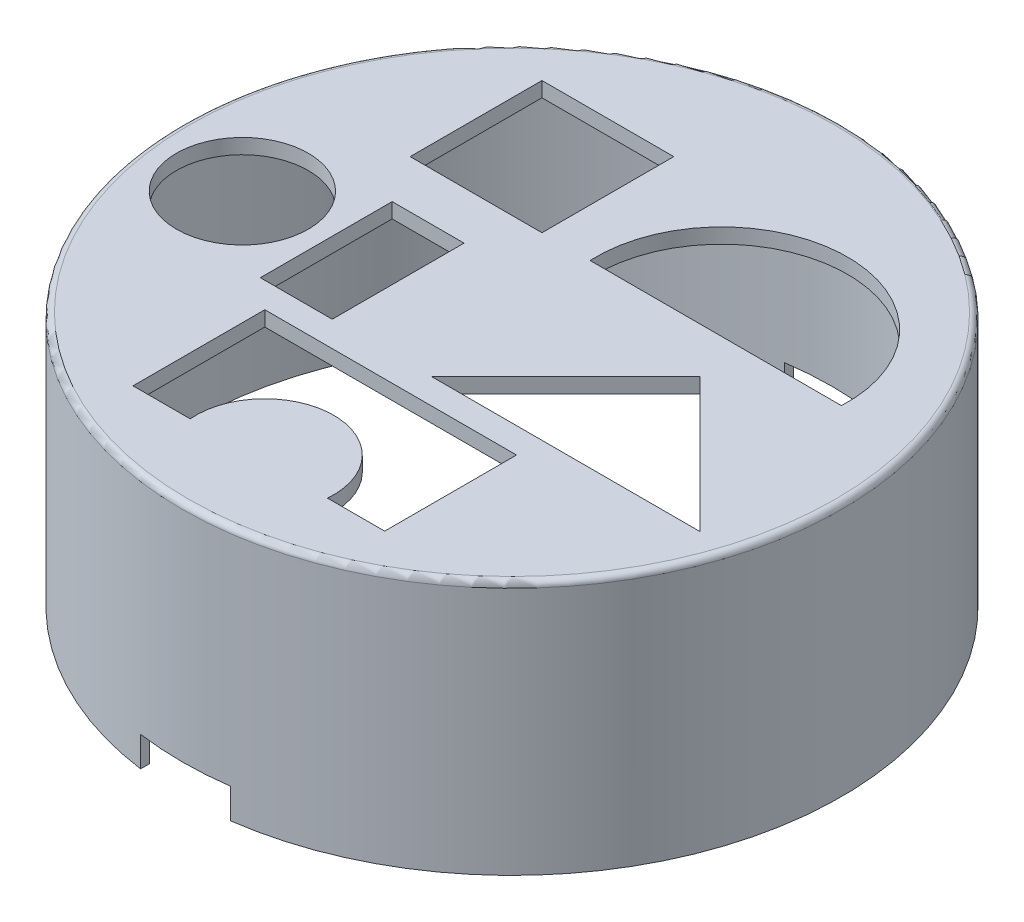
ISO-10303-21;
HEADER;
FILE_DESCRIPTION(('STEP AP214'),'2;1');
FILE_NAME('part.step','',(''),(''),'','','');
FILE_SCHEMA(('AUTOMOTIVE_DESIGN { 1 0 10303 214 1 1 1 1 }'));
ENDSEC;
DATA;
#1=APPLICATION_CONTEXT('core data for automotive mechanical design processes');
#2=APPLICATION_PROTOCOL_DEFINITION('international standard','automotive_design',2000,#1);
#3=PRODUCT_CONTEXT('',#1,'mechanical');
#4=PRODUCT('Part','Part','',(#3));
#5=PRODUCT_RELATED_PRODUCT_CATEGORY('part','',(#4));
#6=PRODUCT_DEFINITION_FORMATION('','',#4);
#7=PRODUCT_DEFINITION_CONTEXT('part definition',#1,'design');
#8=PRODUCT_DEFINITION('design','',#6,#7);
#9=PRODUCT_DEFINITION_SHAPE('','',#8);
#10=(LENGTH_UNIT() NAMED_UNIT(*) SI_UNIT(.MILLI.,.METRE.));
#11=(NAMED_UNIT(*) PLANE_ANGLE_UNIT() SI_UNIT($,.RADIAN.));
#12=(NAMED_UNIT(*) SI_UNIT($,.STERADIAN.) SOLID_ANGLE_UNIT());
#13=UNCERTAINTY_MEASURE_WITH_UNIT(LENGTH_MEASURE(1.E-05),#10,'distance_accuracy_value','');
#14=(GEOMETRIC_REPRESENTATION_CONTEXT(3) GLOBAL_UNCERTAINTY_ASSIGNED_CONTEXT((#13)) GLOBAL_UNIT_ASSIGNED_CONTEXT((#10,
#11,#12)) REPRESENTATION_CONTEXT('',''));
#15=CARTESIAN_POINT('',(0.,0.,0.));
#16=DIRECTION('',(0.,0.,1.));
#17=DIRECTION('',(1.,0.,0.));
#18=AXIS2_PLACEMENT_3D('',#15,#16,#17);
#19=CARTESIAN_POINT('',(0.,-40.,0.));
#20=DIRECTION('',(0.,-1.,0.));
#21=DIRECTION('',(0.,0.,-1.));
#22=AXIS2_PLACEMENT_3D('',#19,#20,#21);
#23=PLANE('',#22);
#24=DIRECTION('',(0.,0.,1.));
#25=VECTOR('',#24,1.);
#26=CARTESIAN_POINT('',(7.5,-40.,-55.));
#27=LINE('',#26,#25);
#28=CARTESIAN_POINT('',(7.5,-40.,-54.4862367942584));
#29=VERTEX_POINT('',#28);
#30=CARTESIAN_POINT('',(7.5,-40.,-52.9716905525961));
#31=VERTEX_POINT('',#30);
#32=EDGE_CURVE('E249',#29,#31,#27,.T.);
#33=ORIENTED_EDGE('',*,*,#32,.F.);
#34=CARTESIAN_POINT('',(0.,-40.,0.));
#35=DIRECTION('',(0.,-1.,0.));
#36=DIRECTION('',(0.,0.,-1.));
#37=AXIS2_PLACEMENT_3D('',#34,#35,#36);
#38=CIRCLE('',#37,55.);
#39=CARTESIAN_POINT('',(7.5,-40.,54.4862367942584));
#40=VERTEX_POINT('',#39);
#41=EDGE_CURVE('E420',#29,#40,#38,.T.);
#42=ORIENTED_EDGE('',*,*,#41,.T.);
#43=CARTESIAN_POINT('',(7.5,-40.,52.9716905525961));
#44=VERTEX_POINT('',#43);
#45=EDGE_CURVE('E443',#44,#40,#27,.T.);
#46=ORIENTED_EDGE('',*,*,#45,.F.);
#47=CARTESIAN_POINT('',(0.,-40.,0.));
#48=DIRECTION('',(0.,-1.,0.));
#49=DIRECTION('',(0.,0.,-1.));
#50=AXIS2_PLACEMENT_3D('',#47,#48,#49);
#51=CIRCLE('',#50,53.5);
#52=EDGE_CURVE('E415',#31,#44,#51,.T.);
#53=ORIENTED_EDGE('',*,*,#52,.F.);
#54=EDGE_LOOP('',(#33,#42,#46,#53));
#55=FACE_BOUND('',#54,.T.);
#56=ADVANCED_FACE('F39',(#55),#23,.T.);
#57=CARTESIAN_POINT('',(0.,0.,0.));
#58=DIRECTION('',(0.,1.,0.));
#59=DIRECTION('',(0.,0.,1.));
#60=AXIS2_PLACEMENT_3D('',#57,#58,#59);
#61=PLANE('',#60);
#62=CARTESIAN_POINT('',(0.,0.,0.));
#63=DIRECTION('',(0.,1.,0.));
#64=DIRECTION('',(0.,0.,1.));
#65=AXIS2_PLACEMENT_3D('',#62,#63,#64);
#66=CIRCLE('',#65,52.5);
#67=CARTESIAN_POINT('',(0.,0.,52.5));
#68=VERTEX_POINT('',#67);
#69=EDGE_CURVE('E427',#68,#68,#66,.F.);
#70=ORIENTED_EDGE('',*,*,#69,.T.);
#71=EDGE_LOOP('',(#70));
#72=FACE_BOUND('',#71,.T.);
#73=CARTESIAN_POINT('',(-40.,0.,5.00000000000001));
#74=DIRECTION('',(0.,1.,0.));
#75=DIRECTION('',(0.,0.,1.));
#76=AXIS2_PLACEMENT_3D('',#73,#74,#75);
#77=CIRCLE('',#76,11.);
#78=CARTESIAN_POINT('',(-40.,0.,16.));
#79=VERTEX_POINT('',#78);
#80=EDGE_CURVE('E355',#79,#79,#77,.T.);
#81=ORIENTED_EDGE('',*,*,#80,.T.);
#82=EDGE_LOOP('',(#81));
#83=FACE_BOUND('',#82,.T.);
#84=DIRECTION('',(0.,0.,1.));
#85=VECTOR('',#84,1.);
#86=CARTESIAN_POINT('',(-26.,0.,0.));
#87=LINE('',#86,#85);
#88=CARTESIAN_POINT('',(-26.,0.,-5.99999999999998));
#89=VERTEX_POINT('',#88);
#90=CARTESIAN_POINT('',(-26.,0.,16.));
#91=VERTEX_POINT('',#90);
#92=EDGE_CURVE('E364',#89,#91,#87,.T.);
#93=ORIENTED_EDGE('',*,*,#92,.T.);
#94=DIRECTION('',(1.,0.,0.));
#95=VECTOR('',#94,1.);
#96=CARTESIAN_POINT('',(0.,0.,16.));
#97=LINE('',#96,#95);
#98=CARTESIAN_POINT('',(-14.,0.,16.));
#99=VERTEX_POINT('',#98);
#100=EDGE_CURVE('E367',#91,#99,#97,.T.);
#101=ORIENTED_EDGE('',*,*,#100,.T.);
#102=DIRECTION('',(0.,0.,-1.));
#103=VECTOR('',#102,1.);
#104=CARTESIAN_POINT('',(-14.,0.,0.));
#105=LINE('',#104,#103);
#106=CARTESIAN_POINT('',(-14.,0.,-5.99999999999999));
#107=VERTEX_POINT('',#106);
#108=EDGE_CURVE('E358',#99,#107,#105,.T.);
#109=ORIENTED_EDGE('',*,*,#108,.T.);
#110=DIRECTION('',(-1.,0.,0.));
#111=VECTOR('',#110,1.);
#112=CARTESIAN_POINT('',(0.,0.,-5.99999999999999));
#113=LINE('',#112,#111);
#114=EDGE_CURVE('E361',#107,#89,#113,.T.);
#115=ORIENTED_EDGE('',*,*,#114,.T.);
#116=EDGE_LOOP('',(#93,#101,#109,#115));
#117=FACE_BOUND('',#116,.T.);
#118=DIRECTION('',(0.,0.,1.));
#119=VECTOR('',#118,1.);
#120=CARTESIAN_POINT('',(-31.,0.,0.));
#121=LINE('',#120,#119);
#122=CARTESIAN_POINT('',(-31.,0.,-36.));
#123=VERTEX_POINT('',#122);
#124=CARTESIAN_POINT('',(-31.,0.,-14.));
#125=VERTEX_POINT('',#124);
#126=EDGE_CURVE('E376',#123,#125,#121,.T.);
#127=ORIENTED_EDGE('',*,*,#126,.T.);
#128=DIRECTION('',(1.,0.,0.));
#129=VECTOR('',#128,1.);
#130=CARTESIAN_POINT('',(0.,0.,-14.));
#131=LINE('',#130,#129);
#132=CARTESIAN_POINT('',(-8.99999999999999,0.,-14.));
#133=VERTEX_POINT('',#132);
#134=EDGE_CURVE('E379',#125,#133,#131,.T.);
#135=ORIENTED_EDGE('',*,*,#134,.T.);
#136=DIRECTION('',(0.,0.,-1.));
#137=VECTOR('',#136,1.);
#138=CARTESIAN_POINT('',(-8.99999999999999,0.,0.));
#139=LINE('',#138,#137);
#140=CARTESIAN_POINT('',(-8.99999999999999,0.,-36.));
#141=VERTEX_POINT('',#140);
#142=EDGE_CURVE('E370',#133,#141,#139,.T.);
#143=ORIENTED_EDGE('',*,*,#142,.T.);
#144=DIRECTION('',(-1.,0.,0.));
#145=VECTOR('',#144,1.);
#146=CARTESIAN_POINT('',(0.,0.,-36.));
#147=LINE('',#146,#145);
#148=EDGE_CURVE('E373',#141,#123,#147,.T.);
#149=ORIENTED_EDGE('',*,*,#148,.T.);
#150=EDGE_LOOP('',(#127,#135,#143,#149));
#151=FACE_BOUND('',#150,.T.);
#152=CARTESIAN_POINT('',(20.,0.,-15.));
#153=DIRECTION('',(0.,1.,0.));
#154=DIRECTION('',(0.,0.,1.));
#155=AXIS2_PLACEMENT_3D('',#152,#153,#154);
#156=CIRCLE('',#155,21.);
#157=CARTESIAN_POINT('',(40.976176963403,0.,-14.));
#158=VERTEX_POINT('',#157);
#159=CARTESIAN_POINT('',(-0.976176963403033,0.,-14.));
#160=VERTEX_POINT('',#159);
#161=EDGE_CURVE('E382',#158,#160,#156,.T.);
#162=ORIENTED_EDGE('',*,*,#161,.T.);
#163=DIRECTION('',(1.,0.,0.));
#164=VECTOR('',#163,1.);
#165=CARTESIAN_POINT('',(0.,0.,-14.));
#166=LINE('',#165,#164);
#167=EDGE_CURVE('E385',#160,#158,#166,.T.);
#168=ORIENTED_EDGE('',*,*,#167,.T.);
#169=EDGE_LOOP('',(#162,#168));
#170=FACE_BOUND('',#169,.T.);
#171=DIRECTION('',(-0.707106781186548,0.,0.707106781186548));
#172=VECTOR('',#171,1.);
#173=CARTESIAN_POINT('',(9.29289321881345,0.,9.29289321881345));
#174=LINE('',#173,#172);
#175=CARTESIAN_POINT('',(25.,0.,-6.41421356237309));
#176=VERTEX_POINT('',#175);
#177=CARTESIAN_POINT('',(2.5857864376269,0.,16.));
#178=VERTEX_POINT('',#177);
#179=EDGE_CURVE('E391',#176,#178,#174,.T.);
#180=ORIENTED_EDGE('',*,*,#179,.T.);
#181=DIRECTION('',(1.,0.,0.));
#182=VECTOR('',#181,1.);
#183=CARTESIAN_POINT('',(0.,0.,16.));
#184=LINE('',#183,#182);
#185=CARTESIAN_POINT('',(47.4142135623731,0.,16.));
#186=VERTEX_POINT('',#185);
#187=EDGE_CURVE('E394',#178,#186,#184,.T.);
#188=ORIENTED_EDGE('',*,*,#187,.T.);
#189=DIRECTION('',(-0.707106781186547,0.,-0.707106781186548));
#190=VECTOR('',#189,1.);
#191=CARTESIAN_POINT('',(15.7071067811866,0.,-15.7071067811865));
#192=LINE('',#191,#190);
#193=EDGE_CURVE('E388',#186,#176,#192,.T.);
#194=ORIENTED_EDGE('',*,*,#193,.T.);
#195=EDGE_LOOP('',(#180,#188,#194));
#196=FACE_BOUND('',#195,.T.);
#197=CARTESIAN_POINT('',(0.,0.,41.25));
#198=DIRECTION('',(0.,1.,0.));
#199=DIRECTION('',(0.,0.,1.));
#200=AXIS2_PLACEMENT_3D('',#197,#198,#199);
#201=CIRCLE('',#200,11.5);
#202=CARTESIAN_POINT('',(11.4564392373896,0.,42.25));
#203=VERTEX_POINT('',#202);
#204=CARTESIAN_POINT('',(-11.4564392373896,0.,42.25));
#205=VERTEX_POINT('',#204);
#206=EDGE_CURVE('E412',#203,#205,#201,.T.);
#207=ORIENTED_EDGE('',*,*,#206,.F.);
#208=DIRECTION('',(1.,0.,0.));
#209=VECTOR('',#208,1.);
#210=CARTESIAN_POINT('',(0.,0.,42.25));
#211=LINE('',#210,#209);
#212=CARTESIAN_POINT('',(21.,0.,42.25));
#213=VERTEX_POINT('',#212);
#214=EDGE_CURVE('E397',#203,#213,#211,.T.);
#215=ORIENTED_EDGE('',*,*,#214,.T.);
#216=DIRECTION('',(0.,0.,-1.));
#217=VECTOR('',#216,1.);
#218=CARTESIAN_POINT('',(21.,0.,0.));
#219=LINE('',#218,#217);
#220=CARTESIAN_POINT('',(21.,0.,20.25));
#221=VERTEX_POINT('',#220);
#222=EDGE_CURVE('E400',#213,#221,#219,.T.);
#223=ORIENTED_EDGE('',*,*,#222,.T.);
#224=DIRECTION('',(-1.,0.,0.));
#225=VECTOR('',#224,1.);
#226=CARTESIAN_POINT('',(0.,0.,20.25));
#227=LINE('',#226,#225);
#228=CARTESIAN_POINT('',(-21.,0.,20.25));
#229=VERTEX_POINT('',#228);
#230=EDGE_CURVE('E403',#221,#229,#227,.T.);
#231=ORIENTED_EDGE('',*,*,#230,.T.);
#232=DIRECTION('',(0.,0.,1.));
#233=VECTOR('',#232,1.);
#234=CARTESIAN_POINT('',(-21.,0.,0.));
#235=LINE('',#234,#233);
#236=CARTESIAN_POINT('',(-21.,0.,42.25));
#237=VERTEX_POINT('',#236);
#238=EDGE_CURVE('E406',#229,#237,#235,.T.);
#239=ORIENTED_EDGE('',*,*,#238,.T.);
#240=DIRECTION('',(1.,0.,0.));
#241=VECTOR('',#240,1.);
#242=CARTESIAN_POINT('',(0.,0.,42.25));
#243=LINE('',#242,#241);
#244=EDGE_CURVE('E409',#237,#205,#243,.T.);
#245=ORIENTED_EDGE('',*,*,#244,.T.);
#246=EDGE_LOOP('',(#207,#215,#223,#231,#239,#245));
#247=FACE_BOUND('',#246,.T.);
#248=ADVANCED_FACE('F471',(#72,#83,#117,#151,#170,#196,#247),#61,.F.);
#249=CARTESIAN_POINT('',(0.,2.5,0.));
#250=DIRECTION('',(0.,1.,0.));
#251=DIRECTION('',(0.,0.,1.));
#252=AXIS2_PLACEMENT_3D('',#249,#250,#251);
#253=PLANE('',#252);
#254=CARTESIAN_POINT('',(0.,2.5,0.));
#255=DIRECTION('',(0.,1.,0.));
#256=DIRECTION('',(0.,0.,1.));
#257=AXIS2_PLACEMENT_3D('',#254,#255,#256);
#258=CIRCLE('',#257,54.);
#259=CARTESIAN_POINT('',(0.,2.5,54.));
#260=VERTEX_POINT('',#259);
#261=EDGE_CURVE('E421',#260,#260,#258,.T.);
#262=ORIENTED_EDGE('',*,*,#261,.T.);
#263=EDGE_LOOP('',(#262));
#264=FACE_BOUND('',#263,.T.);
#265=CARTESIAN_POINT('',(-40.,2.5,5.00000000000001));
#266=DIRECTION('',(0.,1.,0.));
#267=DIRECTION('',(0.,0.,1.));
#268=AXIS2_PLACEMENT_3D('',#265,#266,#267);
#269=CIRCLE('',#268,11.);
#270=CARTESIAN_POINT('',(-40.,2.5,16.));
#271=VERTEX_POINT('',#270);
#272=EDGE_CURVE('E272',#271,#271,#269,.T.);
#273=ORIENTED_EDGE('',*,*,#272,.F.);
#274=EDGE_LOOP('',(#273));
#275=FACE_BOUND('',#274,.T.);
#276=DIRECTION('',(1.,0.,0.));
#277=VECTOR('',#276,1.);
#278=CARTESIAN_POINT('',(0.,2.5,16.));
#279=LINE('',#278,#277);
#280=CARTESIAN_POINT('',(-26.,2.5,16.));
#281=VERTEX_POINT('',#280);
#282=CARTESIAN_POINT('',(-14.,2.5,16.));
#283=VERTEX_POINT('',#282);
#284=EDGE_CURVE('E257',#281,#283,#279,.T.);
#285=ORIENTED_EDGE('',*,*,#284,.F.);
#286=DIRECTION('',(0.,0.,1.));
#287=VECTOR('',#286,1.);
#288=CARTESIAN_POINT('',(-26.,2.5,0.));
#289=LINE('',#288,#287);
#290=CARTESIAN_POINT('',(-26.,2.5,-5.99999999999998));
#291=VERTEX_POINT('',#290);
#292=EDGE_CURVE('E266',#291,#281,#289,.T.);
#293=ORIENTED_EDGE('',*,*,#292,.F.);
#294=DIRECTION('',(-1.,0.,0.));
#295=VECTOR('',#294,1.);
#296=CARTESIAN_POINT('',(0.,2.5,-5.99999999999999));
#297=LINE('',#296,#295);
#298=CARTESIAN_POINT('',(-14.,2.5,-5.99999999999999));
#299=VERTEX_POINT('',#298);
#300=EDGE_CURVE('E263',#299,#291,#297,.T.);
#301=ORIENTED_EDGE('',*,*,#300,.F.);
#302=DIRECTION('',(0.,0.,-1.));
#303=VECTOR('',#302,1.);
#304=CARTESIAN_POINT('',(-14.,2.5,0.));
#305=LINE('',#304,#303);
#306=EDGE_CURVE('E259',#283,#299,#305,.T.);
#307=ORIENTED_EDGE('',*,*,#306,.F.);
#308=EDGE_LOOP('',(#285,#293,#301,#307));
#309=FACE_BOUND('',#308,.T.);
#310=DIRECTION('',(1.,0.,0.));
#311=VECTOR('',#310,1.);
#312=CARTESIAN_POINT('',(0.,2.5,-14.));
#313=LINE('',#312,#311);
#314=CARTESIAN_POINT('',(-31.,2.5,-14.));
#315=VERTEX_POINT('',#314);
#316=CARTESIAN_POINT('',(-8.99999999999999,2.5,-14.));
#317=VERTEX_POINT('',#316);
#318=EDGE_CURVE('E279',#315,#317,#313,.T.);
#319=ORIENTED_EDGE('',*,*,#318,.F.);
#320=DIRECTION('',(0.,0.,1.));
#321=VECTOR('',#320,1.);
#322=CARTESIAN_POINT('',(-31.,2.5,0.));
#323=LINE('',#322,#321);
#324=CARTESIAN_POINT('',(-31.,2.5,-36.));
#325=VERTEX_POINT('',#324);
#326=EDGE_CURVE('E288',#325,#315,#323,.T.);
#327=ORIENTED_EDGE('',*,*,#326,.F.);
#328=DIRECTION('',(-1.,0.,0.));
#329=VECTOR('',#328,1.);
#330=CARTESIAN_POINT('',(0.,2.5,-36.));
#331=LINE('',#330,#329);
#332=CARTESIAN_POINT('',(-8.99999999999999,2.5,-36.));
#333=VERTEX_POINT('',#332);
#334=EDGE_CURVE('E285',#333,#325,#331,.T.);
#335=ORIENTED_EDGE('',*,*,#334,.F.);
#336=DIRECTION('',(0.,0.,-1.));
#337=VECTOR('',#336,1.);
#338=CARTESIAN_POINT('',(-8.99999999999999,2.5,0.));
#339=LINE('',#338,#337);
#340=EDGE_CURVE('E281',#317,#333,#339,.T.);
#341=ORIENTED_EDGE('',*,*,#340,.F.);
#342=EDGE_LOOP('',(#319,#327,#335,#341));
#343=FACE_BOUND('',#342,.T.);
#344=DIRECTION('',(1.,0.,0.));
#345=VECTOR('',#344,1.);
#346=CARTESIAN_POINT('',(0.,2.5,-14.));
#347=LINE('',#346,#345);
#348=CARTESIAN_POINT('',(-0.976176963403033,2.5,-14.));
#349=VERTEX_POINT('',#348);
#350=CARTESIAN_POINT('',(40.976176963403,2.5,-14.));
#351=VERTEX_POINT('',#350);
#352=EDGE_CURVE('E299',#349,#351,#347,.T.);
#353=ORIENTED_EDGE('',*,*,#352,.F.);
#354=CARTESIAN_POINT('',(20.,2.5,-15.));
#355=DIRECTION('',(0.,1.,0.));
#356=DIRECTION('',(0.,0.,1.));
#357=AXIS2_PLACEMENT_3D('',#354,#355,#356);
#358=CIRCLE('',#357,21.);
#359=EDGE_CURVE('E301',#351,#349,#358,.T.);
#360=ORIENTED_EDGE('',*,*,#359,.F.);
#361=EDGE_LOOP('',(#353,#360));
#362=FACE_BOUND('',#361,.T.);
#363=DIRECTION('',(1.,0.,0.));
#364=VECTOR('',#363,1.);
#365=CARTESIAN_POINT('',(0.,2.5,16.));
#366=LINE('',#365,#364);
#367=CARTESIAN_POINT('',(2.5857864376269,2.5,16.));
#368=VERTEX_POINT('',#367);
#369=CARTESIAN_POINT('',(47.4142135623731,2.5,16.));
#370=VERTEX_POINT('',#369);
#371=EDGE_CURVE('E309',#368,#370,#366,.T.);
#372=ORIENTED_EDGE('',*,*,#371,.F.);
#373=DIRECTION('',(-0.707106781186548,0.,0.707106781186548));
#374=VECTOR('',#373,1.);
#375=CARTESIAN_POINT('',(9.29289321881345,2.5,9.29289321881345));
#376=LINE('',#375,#374);
#377=CARTESIAN_POINT('',(25.,2.5,-6.41421356237309));
#378=VERTEX_POINT('',#377);
#379=EDGE_CURVE('E315',#378,#368,#376,.T.);
#380=ORIENTED_EDGE('',*,*,#379,.F.);
#381=DIRECTION('',(-0.707106781186547,0.,-0.707106781186548));
#382=VECTOR('',#381,1.);
#383=CARTESIAN_POINT('',(15.7071067811866,2.5,-15.7071067811865));
#384=LINE('',#383,#382);
#385=EDGE_CURVE('E311',#370,#378,#384,.T.);
#386=ORIENTED_EDGE('',*,*,#385,.F.);
#387=EDGE_LOOP('',(#372,#380,#386));
#388=FACE_BOUND('',#387,.T.);
#389=DIRECTION('',(1.,0.,0.));
#390=VECTOR('',#389,1.);
#391=CARTESIAN_POINT('',(0.,2.5,42.25));
#392=LINE('',#391,#390);
#393=CARTESIAN_POINT('',(11.4564392373896,2.5,42.25));
#394=VERTEX_POINT('',#393);
#395=CARTESIAN_POINT('',(21.,2.5,42.25));
#396=VERTEX_POINT('',#395);
#397=EDGE_CURVE('E326',#394,#396,#392,.T.);
#398=ORIENTED_EDGE('',*,*,#397,.F.);
#399=CARTESIAN_POINT('',(0.,2.5,41.25));
#400=DIRECTION('',(0.,1.,0.));
#401=DIRECTION('',(0.,0.,1.));
#402=AXIS2_PLACEMENT_3D('',#399,#400,#401);
#403=CIRCLE('',#402,11.5);
#404=CARTESIAN_POINT('',(-11.4564392373896,2.5,42.25));
#405=VERTEX_POINT('',#404);
#406=EDGE_CURVE('E256',#394,#405,#403,.T.);
#407=ORIENTED_EDGE('',*,*,#406,.T.);
#408=DIRECTION('',(1.,0.,0.));
#409=VECTOR('',#408,1.);
#410=CARTESIAN_POINT('',(0.,2.5,42.25));
#411=LINE('',#410,#409);
#412=CARTESIAN_POINT('',(-21.,2.5,42.25));
#413=VERTEX_POINT('',#412);
#414=EDGE_CURVE('E338',#413,#405,#411,.T.);
#415=ORIENTED_EDGE('',*,*,#414,.F.);
#416=DIRECTION('',(0.,0.,1.));
#417=VECTOR('',#416,1.);
#418=CARTESIAN_POINT('',(-21.,2.5,0.));
#419=LINE('',#418,#417);
#420=CARTESIAN_POINT('',(-21.,2.5,20.25));
#421=VERTEX_POINT('',#420);
#422=EDGE_CURVE('E335',#421,#413,#419,.T.);
#423=ORIENTED_EDGE('',*,*,#422,.F.);
#424=DIRECTION('',(-1.,0.,0.));
#425=VECTOR('',#424,1.);
#426=CARTESIAN_POINT('',(0.,2.5,20.25));
#427=LINE('',#426,#425);
#428=CARTESIAN_POINT('',(21.,2.5,20.25));
#429=VERTEX_POINT('',#428);
#430=EDGE_CURVE('E332',#429,#421,#427,.T.);
#431=ORIENTED_EDGE('',*,*,#430,.F.);
#432=DIRECTION('',(0.,0.,-1.));
#433=VECTOR('',#432,1.);
#434=CARTESIAN_POINT('',(21.,2.5,0.));
#435=LINE('',#434,#433);
#436=EDGE_CURVE('E329',#396,#429,#435,.T.);
#437=ORIENTED_EDGE('',*,*,#436,.F.);
#438=EDGE_LOOP('',(#398,#407,#415,#423,#431,#437));
#439=FACE_BOUND('',#438,.T.);
#440=ADVANCED_FACE('F477',(#264,#275,#309,#343,#362,#388,#439),#253,.T.);
#441=CARTESIAN_POINT('',(0.,2.5,0.));
#442=DIRECTION('',(0.,-1.,0.));
#443=DIRECTION('',(0.,0.,-1.));
#444=AXIS2_PLACEMENT_3D('',#441,#442,#443);
#445=CYLINDRICAL_SURFACE('',#444,55.);
#446=CARTESIAN_POINT('',(0.,1.5,0.));
#447=DIRECTION('',(0.,1.,0.));
#448=DIRECTION('',(0.,0.,1.));
#449=AXIS2_PLACEMENT_3D('',#446,#447,#448);
#450=CIRCLE('',#449,55.);
#451=CARTESIAN_POINT('',(0.,1.5,55.));
#452=VERTEX_POINT('',#451);
#453=EDGE_CURVE('E424',#452,#452,#450,.F.);
#454=ORIENTED_EDGE('',*,*,#453,.T.);
#455=EDGE_LOOP('',(#454));
#456=FACE_BOUND('',#455,.T.);
#457=CARTESIAN_POINT('',(0.,-35.,0.));
#458=DIRECTION('',(0.,1.,0.));
#459=DIRECTION('',(0.,0.,1.));
#460=AXIS2_PLACEMENT_3D('',#457,#458,#459);
#461=CIRCLE('',#460,55.);
#462=CARTESIAN_POINT('',(-7.5,-35.,54.4862367942584));
#463=VERTEX_POINT('',#462);
#464=CARTESIAN_POINT('',(7.5,-35.,54.4862367942584));
#465=VERTEX_POINT('',#464);
#466=EDGE_CURVE('E227',#463,#465,#461,.T.);
#467=ORIENTED_EDGE('',*,*,#466,.T.);
#468=DIRECTION('',(0.,-1.,0.));
#469=VECTOR('',#468,1.);
#470=CARTESIAN_POINT('',(7.5,2.5,54.4862367942584));
#471=LINE('',#470,#469);
#472=EDGE_CURVE('E253',#465,#40,#471,.T.);
#473=ORIENTED_EDGE('',*,*,#472,.T.);
#474=ORIENTED_EDGE('',*,*,#41,.F.);
#475=DIRECTION('',(0.,-1.,0.));
#476=VECTOR('',#475,1.);
#477=CARTESIAN_POINT('',(7.5,2.5,-54.4862367942584));
#478=LINE('',#477,#476);
#479=CARTESIAN_POINT('',(7.5,-35.,-54.4862367942584));
#480=VERTEX_POINT('',#479);
#481=EDGE_CURVE('E224',#29,#480,#478,.F.);
#482=ORIENTED_EDGE('',*,*,#481,.T.);
#483=CARTESIAN_POINT('',(-7.5,-35.,-54.4862367942584));
#484=VERTEX_POINT('',#483);
#485=EDGE_CURVE('E217',#480,#484,#461,.T.);
#486=ORIENTED_EDGE('',*,*,#485,.T.);
#487=DIRECTION('',(0.,-1.,0.));
#488=VECTOR('',#487,1.);
#489=CARTESIAN_POINT('',(-7.5,2.5,-54.4862367942584));
#490=LINE('',#489,#488);
#491=CARTESIAN_POINT('',(-7.5,-40.,-54.4862367942584));
#492=VERTEX_POINT('',#491);
#493=EDGE_CURVE('E221',#484,#492,#490,.T.);
#494=ORIENTED_EDGE('',*,*,#493,.T.);
#495=CARTESIAN_POINT('',(-7.5,-40.,54.4862367942584));
#496=VERTEX_POINT('',#495);
#497=EDGE_CURVE('E418',#496,#492,#38,.T.);
#498=ORIENTED_EDGE('',*,*,#497,.F.);
#499=DIRECTION('',(0.,-1.,0.));
#500=VECTOR('',#499,1.);
#501=CARTESIAN_POINT('',(-7.5,2.5,54.4862367942584));
#502=LINE('',#501,#500);
#503=EDGE_CURVE('E226',#496,#463,#502,.F.);
#504=ORIENTED_EDGE('',*,*,#503,.T.);
#505=EDGE_LOOP('',(#467,#473,#474,#482,#486,#494,#498,#504));
#506=FACE_BOUND('',#505,.T.);
#507=ADVANCED_FACE('F219',(#456,#506),#445,.T.);
#508=DIRECTION('',(0.,0.,1.));
#509=VECTOR('',#508,1.);
#510=CARTESIAN_POINT('',(-7.5,-40.,-55.));
#511=LINE('',#510,#509);
#512=CARTESIAN_POINT('',(-7.5,-40.,52.9716905525961));
#513=VERTEX_POINT('',#512);
#514=EDGE_CURVE('E240',#513,#496,#511,.T.);
#515=ORIENTED_EDGE('',*,*,#514,.T.);
#516=ORIENTED_EDGE('',*,*,#497,.T.);
#517=CARTESIAN_POINT('',(-7.5,-40.,-52.9716905525961));
#518=VERTEX_POINT('',#517);
#519=EDGE_CURVE('E235',#492,#518,#511,.T.);
#520=ORIENTED_EDGE('',*,*,#519,.T.);
#521=EDGE_CURVE('E414',#513,#518,#51,.T.);
#522=ORIENTED_EDGE('',*,*,#521,.F.);
#523=EDGE_LOOP('',(#515,#516,#520,#522));
#524=FACE_BOUND('',#523,.T.);
#525=ADVANCED_FACE('F442',(#524),#23,.T.);
#526=CARTESIAN_POINT('',(0.,-40.,0.));
#527=DIRECTION('',(0.,1.,0.));
#528=DIRECTION('',(0.,0.,1.));
#529=AXIS2_PLACEMENT_3D('',#526,#527,#528);
#530=CYLINDRICAL_SURFACE('',#529,53.5);
#531=DIRECTION('',(0.,1.,0.));
#532=VECTOR('',#531,1.);
#533=CARTESIAN_POINT('',(7.5,-40.,-52.9716905525961));
#534=LINE('',#533,#532);
#535=CARTESIAN_POINT('',(7.5,-35.,-52.9716905525961));
#536=VERTEX_POINT('',#535);
#537=EDGE_CURVE('E11',#31,#536,#534,.T.);
#538=ORIENTED_EDGE('',*,*,#537,.F.);
#539=ORIENTED_EDGE('',*,*,#52,.T.);
#540=DIRECTION('',(0.,1.,0.));
#541=VECTOR('',#540,1.);
#542=CARTESIAN_POINT('',(7.5,-40.,52.9716905525961));
#543=LINE('',#542,#541);
#544=CARTESIAN_POINT('',(7.5,-35.,52.9716905525961));
#545=VERTEX_POINT('',#544);
#546=EDGE_CURVE('E437',#545,#44,#543,.F.);
#547=ORIENTED_EDGE('',*,*,#546,.F.);
#548=CARTESIAN_POINT('',(0.,-35.,0.));
#549=DIRECTION('',(0.,1.,0.));
#550=DIRECTION('',(0.,0.,1.));
#551=AXIS2_PLACEMENT_3D('',#548,#549,#550);
#552=CIRCLE('',#551,53.5);
#553=CARTESIAN_POINT('',(-7.5,-35.,52.9716905525961));
#554=VERTEX_POINT('',#553);
#555=EDGE_CURVE('E433',#554,#545,#552,.T.);
#556=ORIENTED_EDGE('',*,*,#555,.F.);
#557=DIRECTION('',(0.,1.,0.));
#558=VECTOR('',#557,1.);
#559=CARTESIAN_POINT('',(-7.5,-40.,52.9716905525961));
#560=LINE('',#559,#558);
#561=EDGE_CURVE('E435',#513,#554,#560,.T.);
#562=ORIENTED_EDGE('',*,*,#561,.F.);
#563=ORIENTED_EDGE('',*,*,#521,.T.);
#564=DIRECTION('',(0.,1.,0.));
#565=VECTOR('',#564,1.);
#566=CARTESIAN_POINT('',(-7.5,-40.,-52.9716905525961));
#567=LINE('',#566,#565);
#568=CARTESIAN_POINT('',(-7.5,-35.,-52.9716905525961));
#569=VERTEX_POINT('',#568);
#570=EDGE_CURVE('E47',#569,#518,#567,.F.);
#571=ORIENTED_EDGE('',*,*,#570,.F.);
#572=EDGE_CURVE('E239',#536,#569,#552,.T.);
#573=ORIENTED_EDGE('',*,*,#572,.F.);
#574=EDGE_LOOP('',(#538,#539,#547,#556,#562,#563,#571,#573));
#575=FACE_BOUND('',#574,.T.);
#576=CARTESIAN_POINT('',(0.,-1.,0.));
#577=DIRECTION('',(0.,1.,0.));
#578=DIRECTION('',(0.,0.,1.));
#579=AXIS2_PLACEMENT_3D('',#576,#577,#578);
#580=CIRCLE('',#579,53.5);
#581=CARTESIAN_POINT('',(0.,-1.,53.5));
#582=VERTEX_POINT('',#581);
#583=EDGE_CURVE('E430',#582,#582,#580,.T.);
#584=ORIENTED_EDGE('',*,*,#583,.T.);
#585=EDGE_LOOP('',(#584));
#586=FACE_BOUND('',#585,.T.);
#587=ADVANCED_FACE('F446',(#575,#586),#530,.F.);
#588=CARTESIAN_POINT('',(-40.,-2.5,5.00000000000001));
#589=DIRECTION('',(0.,1.,0.));
#590=DIRECTION('',(0.,0.,1.));
#591=AXIS2_PLACEMENT_3D('',#588,#589,#590);
#592=CYLINDRICAL_SURFACE('',#591,11.);
#593=ORIENTED_EDGE('',*,*,#272,.T.);
#594=EDGE_LOOP('',(#593));
#595=FACE_BOUND('',#594,.T.);
#596=ORIENTED_EDGE('',*,*,#80,.F.);
#597=EDGE_LOOP('',(#596));
#598=FACE_BOUND('',#597,.T.);
#599=ADVANCED_FACE('F488',(#595,#598),#592,.F.);
#600=CARTESIAN_POINT('',(0.,-2.5,16.));
#601=DIRECTION('',(0.,0.,1.));
#602=DIRECTION('',(1.,0.,0.));
#603=AXIS2_PLACEMENT_3D('',#600,#601,#602);
#604=PLANE('',#603);
#605=DIRECTION('',(0.,1.,0.));
#606=VECTOR('',#605,1.);
#607=CARTESIAN_POINT('',(-26.,-2.5,16.));
#608=LINE('',#607,#606);
#609=EDGE_CURVE('E270',#91,#281,#608,.T.);
#610=ORIENTED_EDGE('',*,*,#609,.T.);
#611=ORIENTED_EDGE('',*,*,#284,.T.);
#612=DIRECTION('',(0.,1.,0.));
#613=VECTOR('',#612,1.);
#614=CARTESIAN_POINT('',(-14.,-2.5,16.));
#615=LINE('',#614,#613);
#616=EDGE_CURVE('E269',#99,#283,#615,.T.);
#617=ORIENTED_EDGE('',*,*,#616,.F.);
#618=ORIENTED_EDGE('',*,*,#100,.F.);
#619=EDGE_LOOP('',(#610,#611,#617,#618));
#620=FACE_BOUND('',#619,.T.);
#621=ADVANCED_FACE('F559',(#620),#604,.F.);
#622=CARTESIAN_POINT('',(-26.,-2.5,0.));
#623=DIRECTION('',(-1.,0.,0.));
#624=DIRECTION('',(0.,0.,1.));
#625=AXIS2_PLACEMENT_3D('',#622,#623,#624);
#626=PLANE('',#625);
#627=DIRECTION('',(0.,1.,0.));
#628=VECTOR('',#627,1.);
#629=CARTESIAN_POINT('',(-26.,-2.5,-5.99999999999998));
#630=LINE('',#629,#628);
#631=EDGE_CURVE('E273',#89,#291,#630,.T.);
#632=ORIENTED_EDGE('',*,*,#631,.T.);
#633=ORIENTED_EDGE('',*,*,#292,.T.);
#634=ORIENTED_EDGE('',*,*,#609,.F.);
#635=ORIENTED_EDGE('',*,*,#92,.F.);
#636=EDGE_LOOP('',(#632,#633,#634,#635));
#637=FACE_BOUND('',#636,.T.);
#638=ADVANCED_FACE('F564',(#637),#626,.F.);
#639=CARTESIAN_POINT('',(0.,-2.5,-5.99999999999999));
#640=DIRECTION('',(0.,0.,-1.));
#641=DIRECTION('',(-1.,0.,0.));
#642=AXIS2_PLACEMENT_3D('',#639,#640,#641);
#643=PLANE('',#642);
#644=DIRECTION('',(0.,1.,0.));
#645=VECTOR('',#644,1.);
#646=CARTESIAN_POINT('',(-14.,-2.5,-5.99999999999999));
#647=LINE('',#646,#645);
#648=EDGE_CURVE('E275',#107,#299,#647,.T.);
#649=ORIENTED_EDGE('',*,*,#648,.T.);
#650=ORIENTED_EDGE('',*,*,#300,.T.);
#651=ORIENTED_EDGE('',*,*,#631,.F.);
#652=ORIENTED_EDGE('',*,*,#114,.F.);
#653=EDGE_LOOP('',(#649,#650,#651,#652));
#654=FACE_BOUND('',#653,.T.);
#655=ADVANCED_FACE('F703',(#654),#643,.F.);
#656=CARTESIAN_POINT('',(-14.,-2.5,0.));
#657=DIRECTION('',(1.,0.,0.));
#658=DIRECTION('',(0.,0.,-1.));
#659=AXIS2_PLACEMENT_3D('',#656,#657,#658);
#660=PLANE('',#659);
#661=ORIENTED_EDGE('',*,*,#616,.T.);
#662=ORIENTED_EDGE('',*,*,#306,.T.);
#663=ORIENTED_EDGE('',*,*,#648,.F.);
#664=ORIENTED_EDGE('',*,*,#108,.F.);
#665=EDGE_LOOP('',(#661,#662,#663,#664));
#666=FACE_BOUND('',#665,.T.);
#667=ADVANCED_FACE('F707',(#666),#660,.F.);
#668=CARTESIAN_POINT('',(0.,-2.5,-14.));
#669=DIRECTION('',(0.,0.,1.));
#670=DIRECTION('',(1.,0.,0.));
#671=AXIS2_PLACEMENT_3D('',#668,#669,#670);
#672=PLANE('',#671);
#673=DIRECTION('',(0.,1.,0.));
#674=VECTOR('',#673,1.);
#675=CARTESIAN_POINT('',(-31.,-2.5,-14.));
#676=LINE('',#675,#674);
#677=EDGE_CURVE('E260',#125,#315,#676,.T.);
#678=ORIENTED_EDGE('',*,*,#677,.T.);
#679=ORIENTED_EDGE('',*,*,#318,.T.);
#680=DIRECTION('',(0.,1.,0.));
#681=VECTOR('',#680,1.);
#682=CARTESIAN_POINT('',(-8.99999999999999,-2.5,-14.));
#683=LINE('',#682,#681);
#684=EDGE_CURVE('E291',#133,#317,#683,.T.);
#685=ORIENTED_EDGE('',*,*,#684,.F.);
#686=ORIENTED_EDGE('',*,*,#134,.F.);
#687=EDGE_LOOP('',(#678,#679,#685,#686));
#688=FACE_BOUND('',#687,.T.);
#689=ADVANCED_FACE('F710',(#688),#672,.F.);
#690=CARTESIAN_POINT('',(-31.,-2.5,0.));
#691=DIRECTION('',(-1.,0.,0.));
#692=DIRECTION('',(0.,0.,1.));
#693=AXIS2_PLACEMENT_3D('',#690,#691,#692);
#694=PLANE('',#693);
#695=DIRECTION('',(0.,1.,0.));
#696=VECTOR('',#695,1.);
#697=CARTESIAN_POINT('',(-31.,-2.5,-36.));
#698=LINE('',#697,#696);
#699=EDGE_CURVE('E293',#123,#325,#698,.T.);
#700=ORIENTED_EDGE('',*,*,#699,.T.);
#701=ORIENTED_EDGE('',*,*,#326,.T.);
#702=ORIENTED_EDGE('',*,*,#677,.F.);
#703=ORIENTED_EDGE('',*,*,#126,.F.);
#704=EDGE_LOOP('',(#700,#701,#702,#703));
#705=FACE_BOUND('',#704,.T.);
#706=ADVANCED_FACE('F713',(#705),#694,.F.);
#707=CARTESIAN_POINT('',(0.,-2.5,-36.));
#708=DIRECTION('',(0.,0.,-1.));
#709=DIRECTION('',(-1.,0.,0.));
#710=AXIS2_PLACEMENT_3D('',#707,#708,#709);
#711=PLANE('',#710);
#712=DIRECTION('',(0.,1.,0.));
#713=VECTOR('',#712,1.);
#714=CARTESIAN_POINT('',(-8.99999999999999,-2.5,-36.));
#715=LINE('',#714,#713);
#716=EDGE_CURVE('E295',#141,#333,#715,.T.);
#717=ORIENTED_EDGE('',*,*,#716,.T.);
#718=ORIENTED_EDGE('',*,*,#334,.T.);
#719=ORIENTED_EDGE('',*,*,#699,.F.);
#720=ORIENTED_EDGE('',*,*,#148,.F.);
#721=EDGE_LOOP('',(#717,#718,#719,#720));
#722=FACE_BOUND('',#721,.T.);
#723=ADVANCED_FACE('F716',(#722),#711,.F.);
#724=CARTESIAN_POINT('',(-8.99999999999999,-2.5,0.));
#725=DIRECTION('',(1.,0.,0.));
#726=DIRECTION('',(0.,0.,-1.));
#727=AXIS2_PLACEMENT_3D('',#724,#725,#726);
#728=PLANE('',#727);
#729=ORIENTED_EDGE('',*,*,#684,.T.);
#730=ORIENTED_EDGE('',*,*,#340,.T.);
#731=ORIENTED_EDGE('',*,*,#716,.F.);
#732=ORIENTED_EDGE('',*,*,#142,.F.);
#733=EDGE_LOOP('',(#729,#730,#731,#732));
#734=FACE_BOUND('',#733,.T.);
#735=ADVANCED_FACE('F720',(#734),#728,.F.);
#736=CARTESIAN_POINT('',(0.,-2.5,-14.));
#737=DIRECTION('',(0.,0.,1.));
#738=DIRECTION('',(1.,0.,0.));
#739=AXIS2_PLACEMENT_3D('',#736,#737,#738);
#740=PLANE('',#739);
#741=DIRECTION('',(0.,1.,0.));
#742=VECTOR('',#741,1.);
#743=CARTESIAN_POINT('',(-0.976176963403033,-2.5,-14.));
#744=LINE('',#743,#742);
#745=EDGE_CURVE('E282',#160,#349,#744,.T.);
#746=ORIENTED_EDGE('',*,*,#745,.T.);
#747=ORIENTED_EDGE('',*,*,#352,.T.);
#748=DIRECTION('',(0.,1.,0.));
#749=VECTOR('',#748,1.);
#750=CARTESIAN_POINT('',(40.976176963403,-2.5,-14.));
#751=LINE('',#750,#749);
#752=EDGE_CURVE('E305',#158,#351,#751,.T.);
#753=ORIENTED_EDGE('',*,*,#752,.F.);
#754=ORIENTED_EDGE('',*,*,#167,.F.);
#755=EDGE_LOOP('',(#746,#747,#753,#754));
#756=FACE_BOUND('',#755,.T.);
#757=ADVANCED_FACE('F724',(#756),#740,.F.);
#758=CARTESIAN_POINT('',(20.,-2.5,-15.));
#759=DIRECTION('',(0.,1.,0.));
#760=DIRECTION('',(0.,0.,1.));
#761=AXIS2_PLACEMENT_3D('',#758,#759,#760);
#762=CYLINDRICAL_SURFACE('',#761,21.);
#763=ORIENTED_EDGE('',*,*,#752,.T.);
#764=ORIENTED_EDGE('',*,*,#359,.T.);
#765=ORIENTED_EDGE('',*,*,#745,.F.);
#766=ORIENTED_EDGE('',*,*,#161,.F.);
#767=EDGE_LOOP('',(#763,#764,#765,#766));
#768=FACE_BOUND('',#767,.T.);
#769=ADVANCED_FACE('F592',(#768),#762,.F.);
#770=CARTESIAN_POINT('',(0.,-2.5,16.));
#771=DIRECTION('',(0.,0.,1.));
#772=DIRECTION('',(1.,0.,0.));
#773=AXIS2_PLACEMENT_3D('',#770,#771,#772);
#774=PLANE('',#773);
#775=DIRECTION('',(0.,1.,0.));
#776=VECTOR('',#775,1.);
#777=CARTESIAN_POINT('',(2.5857864376269,-2.5,16.));
#778=LINE('',#777,#776);
#779=EDGE_CURVE('E302',#178,#368,#778,.T.);
#780=ORIENTED_EDGE('',*,*,#779,.T.);
#781=ORIENTED_EDGE('',*,*,#371,.T.);
#782=DIRECTION('',(0.,1.,0.));
#783=VECTOR('',#782,1.);
#784=CARTESIAN_POINT('',(47.4142135623731,-2.5,16.));
#785=LINE('',#784,#783);
#786=EDGE_CURVE('E318',#186,#370,#785,.T.);
#787=ORIENTED_EDGE('',*,*,#786,.F.);
#788=ORIENTED_EDGE('',*,*,#187,.F.);
#789=EDGE_LOOP('',(#780,#781,#787,#788));
#790=FACE_BOUND('',#789,.T.);
#791=ADVANCED_FACE('F579',(#790),#774,.F.);
#792=CARTESIAN_POINT('',(9.29289321881345,-2.5,9.29289321881345));
#793=DIRECTION('',(-0.707106781186548,0.,-0.707106781186548));
#794=DIRECTION('',(-0.707106781186548,0.,0.707106781186548));
#795=AXIS2_PLACEMENT_3D('',#792,#793,#794);
#796=PLANE('',#795);
#797=DIRECTION('',(0.,1.,0.));
#798=VECTOR('',#797,1.);
#799=CARTESIAN_POINT('',(25.,-2.5,-6.41421356237309));
#800=LINE('',#799,#798);
#801=EDGE_CURVE('E320',#176,#378,#800,.T.);
#802=ORIENTED_EDGE('',*,*,#801,.T.);
#803=ORIENTED_EDGE('',*,*,#379,.T.);
#804=ORIENTED_EDGE('',*,*,#779,.F.);
#805=ORIENTED_EDGE('',*,*,#179,.F.);
#806=EDGE_LOOP('',(#802,#803,#804,#805));
#807=FACE_BOUND('',#806,.T.);
#808=ADVANCED_FACE('F577',(#807),#796,.F.);
#809=CARTESIAN_POINT('',(15.7071067811866,-2.5,-15.7071067811865));
#810=DIRECTION('',(0.707106781186548,0.,-0.707106781186547));
#811=DIRECTION('',(-0.707106781186547,0.,-0.707106781186548));
#812=AXIS2_PLACEMENT_3D('',#809,#810,#811);
#813=PLANE('',#812);
#814=ORIENTED_EDGE('',*,*,#786,.T.);
#815=ORIENTED_EDGE('',*,*,#385,.T.);
#816=ORIENTED_EDGE('',*,*,#801,.F.);
#817=ORIENTED_EDGE('',*,*,#193,.F.);
#818=EDGE_LOOP('',(#814,#815,#816,#817));
#819=FACE_BOUND('',#818,.T.);
#820=ADVANCED_FACE('F557',(#819),#813,.F.);
#821=CARTESIAN_POINT('',(0.,-2.5,41.25));
#822=DIRECTION('',(0.,1.,0.));
#823=DIRECTION('',(0.,0.,1.));
#824=AXIS2_PLACEMENT_3D('',#821,#822,#823);
#825=CYLINDRICAL_SURFACE('',#824,11.5);
#826=ORIENTED_EDGE('',*,*,#206,.T.);
#827=DIRECTION('',(0.,1.,0.));
#828=VECTOR('',#827,1.);
#829=CARTESIAN_POINT('',(-11.4564392373896,-2.5,42.25));
#830=LINE('',#829,#828);
#831=EDGE_CURVE('E312',#205,#405,#830,.T.);
#832=ORIENTED_EDGE('',*,*,#831,.T.);
#833=ORIENTED_EDGE('',*,*,#406,.F.);
#834=DIRECTION('',(0.,1.,0.));
#835=VECTOR('',#834,1.);
#836=CARTESIAN_POINT('',(11.4564392373896,-2.5,42.25));
#837=LINE('',#836,#835);
#838=EDGE_CURVE('E341',#203,#394,#837,.T.);
#839=ORIENTED_EDGE('',*,*,#838,.F.);
#840=EDGE_LOOP('',(#826,#832,#833,#839));
#841=FACE_BOUND('',#840,.T.);
#842=ADVANCED_FACE('F533',(#841),#825,.T.);
#843=CARTESIAN_POINT('',(0.,-2.5,42.25));
#844=DIRECTION('',(0.,0.,1.));
#845=DIRECTION('',(1.,0.,0.));
#846=AXIS2_PLACEMENT_3D('',#843,#844,#845);
#847=PLANE('',#846);
#848=DIRECTION('',(0.,1.,0.));
#849=VECTOR('',#848,1.);
#850=CARTESIAN_POINT('',(-21.,-2.5,42.25));
#851=LINE('',#850,#849);
#852=EDGE_CURVE('E343',#237,#413,#851,.T.);
#853=ORIENTED_EDGE('',*,*,#852,.T.);
#854=ORIENTED_EDGE('',*,*,#414,.T.);
#855=ORIENTED_EDGE('',*,*,#831,.F.);
#856=ORIENTED_EDGE('',*,*,#244,.F.);
#857=EDGE_LOOP('',(#853,#854,#855,#856));
#858=FACE_BOUND('',#857,.T.);
#859=ADVANCED_FACE('F538',(#858),#847,.F.);
#860=CARTESIAN_POINT('',(-21.,-2.5,0.));
#861=DIRECTION('',(-1.,0.,0.));
#862=DIRECTION('',(0.,0.,1.));
#863=AXIS2_PLACEMENT_3D('',#860,#861,#862);
#864=PLANE('',#863);
#865=DIRECTION('',(0.,1.,0.));
#866=VECTOR('',#865,1.);
#867=CARTESIAN_POINT('',(-21.,-2.5,20.25));
#868=LINE('',#867,#866);
#869=EDGE_CURVE('E345',#229,#421,#868,.T.);
#870=ORIENTED_EDGE('',*,*,#869,.T.);
#871=ORIENTED_EDGE('',*,*,#422,.T.);
#872=ORIENTED_EDGE('',*,*,#852,.F.);
#873=ORIENTED_EDGE('',*,*,#238,.F.);
#874=EDGE_LOOP('',(#870,#871,#872,#873));
#875=FACE_BOUND('',#874,.T.);
#876=ADVANCED_FACE('F540',(#875),#864,.F.);
#877=CARTESIAN_POINT('',(0.,-2.5,20.25));
#878=DIRECTION('',(0.,0.,-1.));
#879=DIRECTION('',(-1.,0.,0.));
#880=AXIS2_PLACEMENT_3D('',#877,#878,#879);
#881=PLANE('',#880);
#882=DIRECTION('',(0.,1.,0.));
#883=VECTOR('',#882,1.);
#884=CARTESIAN_POINT('',(21.,-2.5,20.25));
#885=LINE('',#884,#883);
#886=EDGE_CURVE('E347',#221,#429,#885,.T.);
#887=ORIENTED_EDGE('',*,*,#886,.T.);
#888=ORIENTED_EDGE('',*,*,#430,.T.);
#889=ORIENTED_EDGE('',*,*,#869,.F.);
#890=ORIENTED_EDGE('',*,*,#230,.F.);
#891=EDGE_LOOP('',(#887,#888,#889,#890));
#892=FACE_BOUND('',#891,.T.);
#893=ADVANCED_FACE('F544',(#892),#881,.F.);
#894=CARTESIAN_POINT('',(21.,-2.5,0.));
#895=DIRECTION('',(1.,0.,0.));
#896=DIRECTION('',(0.,0.,-1.));
#897=AXIS2_PLACEMENT_3D('',#894,#895,#896);
#898=PLANE('',#897);
#899=DIRECTION('',(0.,1.,0.));
#900=VECTOR('',#899,1.);
#901=CARTESIAN_POINT('',(21.,-2.5,42.25));
#902=LINE('',#901,#900);
#903=EDGE_CURVE('E349',#213,#396,#902,.T.);
#904=ORIENTED_EDGE('',*,*,#903,.T.);
#905=ORIENTED_EDGE('',*,*,#436,.T.);
#906=ORIENTED_EDGE('',*,*,#886,.F.);
#907=ORIENTED_EDGE('',*,*,#222,.F.);
#908=EDGE_LOOP('',(#904,#905,#906,#907));
#909=FACE_BOUND('',#908,.T.);
#910=ADVANCED_FACE('F501',(#909),#898,.F.);
#911=CARTESIAN_POINT('',(0.,-2.5,42.25));
#912=DIRECTION('',(0.,0.,1.));
#913=DIRECTION('',(1.,0.,0.));
#914=AXIS2_PLACEMENT_3D('',#911,#912,#913);
#915=PLANE('',#914);
#916=ORIENTED_EDGE('',*,*,#838,.T.);
#917=ORIENTED_EDGE('',*,*,#397,.T.);
#918=ORIENTED_EDGE('',*,*,#903,.F.);
#919=ORIENTED_EDGE('',*,*,#214,.F.);
#920=EDGE_LOOP('',(#916,#917,#918,#919));
#921=FACE_BOUND('',#920,.T.);
#922=ADVANCED_FACE('F496',(#921),#915,.F.);
#923=CARTESIAN_POINT('',(0.,1.5,0.));
#924=DIRECTION('',(0.,1.,0.));
#925=DIRECTION('',(0.,0.,1.));
#926=AXIS2_PLACEMENT_3D('',#923,#924,#925);
#927=TOROIDAL_SURFACE('',#926,54.,1.);
#928=ORIENTED_EDGE('',*,*,#453,.F.);
#929=EDGE_LOOP('',(#928));
#930=FACE_BOUND('',#929,.T.);
#931=ORIENTED_EDGE('',*,*,#261,.F.);
#932=EDGE_LOOP('',(#931));
#933=FACE_BOUND('',#932,.T.);
#934=ADVANCED_FACE('F466',(#930,#933),#927,.T.);
#935=CARTESIAN_POINT('',(0.,-1.,0.));
#936=DIRECTION('',(0.,1.,0.));
#937=DIRECTION('',(0.,0.,1.));
#938=AXIS2_PLACEMENT_3D('',#935,#936,#937);
#939=TOROIDAL_SURFACE('',#938,52.5,1.);
#940=ORIENTED_EDGE('',*,*,#583,.F.);
#941=EDGE_LOOP('',(#940));
#942=FACE_BOUND('',#941,.T.);
#943=ORIENTED_EDGE('',*,*,#69,.F.);
#944=EDGE_LOOP('',(#943));
#945=FACE_BOUND('',#944,.T.);
#946=ADVANCED_FACE('F41',(#942,#945),#939,.F.);
#947=CARTESIAN_POINT('',(-7.5,-35.,-55.));
#948=DIRECTION('',(0.,1.,0.));
#949=DIRECTION('',(0.,0.,1.));
#950=AXIS2_PLACEMENT_3D('',#947,#948,#949);
#951=PLANE('',#950);
#952=ORIENTED_EDGE('',*,*,#466,.F.);
#953=DIRECTION('',(0.,0.,1.));
#954=VECTOR('',#953,1.);
#955=CARTESIAN_POINT('',(-7.5,-35.,-55.));
#956=LINE('',#955,#954);
#957=EDGE_CURVE('E61',#554,#463,#956,.T.);
#958=ORIENTED_EDGE('',*,*,#957,.F.);
#959=ORIENTED_EDGE('',*,*,#555,.T.);
#960=DIRECTION('',(0.,0.,1.));
#961=VECTOR('',#960,1.);
#962=CARTESIAN_POINT('',(7.5,-35.,-55.));
#963=LINE('',#962,#961);
#964=EDGE_CURVE('E246',#545,#465,#963,.T.);
#965=ORIENTED_EDGE('',*,*,#964,.T.);
#966=EDGE_LOOP('',(#952,#958,#959,#965));
#967=FACE_BOUND('',#966,.T.);
#968=ADVANCED_FACE('F458',(#967),#951,.F.);
#969=CARTESIAN_POINT('',(-7.5,-40.,-55.));
#970=DIRECTION('',(-1.,0.,0.));
#971=DIRECTION('',(0.,0.,1.));
#972=AXIS2_PLACEMENT_3D('',#969,#970,#971);
#973=PLANE('',#972);
#974=ORIENTED_EDGE('',*,*,#514,.F.);
#975=ORIENTED_EDGE('',*,*,#561,.T.);
#976=ORIENTED_EDGE('',*,*,#957,.T.);
#977=ORIENTED_EDGE('',*,*,#503,.F.);
#978=EDGE_LOOP('',(#974,#975,#976,#977));
#979=FACE_BOUND('',#978,.T.);
#980=ADVANCED_FACE('F451',(#979),#973,.F.);
#981=CARTESIAN_POINT('',(7.5,-40.,-55.));
#982=DIRECTION('',(1.,0.,0.));
#983=DIRECTION('',(0.,0.,-1.));
#984=AXIS2_PLACEMENT_3D('',#981,#982,#983);
#985=PLANE('',#984);
#986=ORIENTED_EDGE('',*,*,#964,.F.);
#987=ORIENTED_EDGE('',*,*,#546,.T.);
#988=ORIENTED_EDGE('',*,*,#45,.T.);
#989=ORIENTED_EDGE('',*,*,#472,.F.);
#990=EDGE_LOOP('',(#986,#987,#988,#989));
#991=FACE_BOUND('',#990,.T.);
#992=ADVANCED_FACE('F456',(#991),#985,.F.);
#993=ORIENTED_EDGE('',*,*,#32,.T.);
#994=ORIENTED_EDGE('',*,*,#537,.T.);
#995=EDGE_CURVE('E54',#480,#536,#963,.T.);
#996=ORIENTED_EDGE('',*,*,#995,.F.);
#997=ORIENTED_EDGE('',*,*,#481,.F.);
#998=EDGE_LOOP('',(#993,#994,#996,#997));
#999=FACE_BOUND('',#998,.T.);
#1000=ADVANCED_FACE('F676',(#999),#985,.F.);
#1001=EDGE_CURVE('E232',#484,#569,#956,.T.);
#1002=ORIENTED_EDGE('',*,*,#1001,.T.);
#1003=ORIENTED_EDGE('',*,*,#570,.T.);
#1004=ORIENTED_EDGE('',*,*,#519,.F.);
#1005=ORIENTED_EDGE('',*,*,#493,.F.);
#1006=EDGE_LOOP('',(#1002,#1003,#1004,#1005));
#1007=FACE_BOUND('',#1006,.T.);
#1008=ADVANCED_FACE('F231',(#1007),#973,.F.);
#1009=ORIENTED_EDGE('',*,*,#995,.T.);
#1010=ORIENTED_EDGE('',*,*,#572,.T.);
#1011=ORIENTED_EDGE('',*,*,#1001,.F.);
#1012=ORIENTED_EDGE('',*,*,#485,.F.);
#1013=EDGE_LOOP('',(#1009,#1010,#1011,#1012));
#1014=FACE_BOUND('',#1013,.T.);
#1015=ADVANCED_FACE('F237',(#1014),#951,.F.);
#1016=CLOSED_SHELL('',(#56,#248,#440,#507,#525,#587,#599,#621,#638,#655,#667,#689,#706,#723,
#735,#757,#769,#791,#808,#820,#842,#859,#876,#893,#910,#922,#934,#946,#968,#980,#992,#1000,
#1008,#1015));
#1017=MANIFOLD_SOLID_BREP('B2',#1016);
#1018=ADVANCED_BREP_SHAPE_REPRESENTATION('',(#18,#1017),#14);
#1019=SHAPE_DEFINITION_REPRESENTATION(#9,#1018);
ENDSEC;
END-ISO-10303-21;
